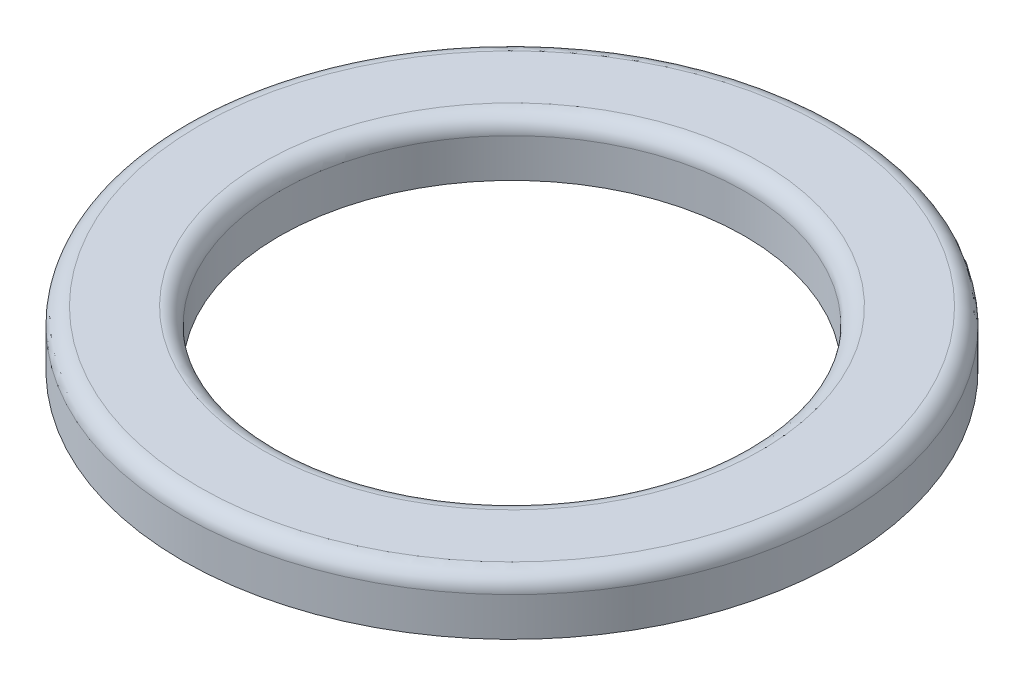
ISO-10303-21;
HEADER;
FILE_DESCRIPTION(('STEP AP214'),'2;1');
FILE_NAME('part.step','',(''),(''),'','','');
FILE_SCHEMA(('AUTOMOTIVE_DESIGN { 1 0 10303 214 1 1 1 1 }'));
ENDSEC;
DATA;
#1=APPLICATION_CONTEXT('core data for automotive mechanical design processes');
#2=APPLICATION_PROTOCOL_DEFINITION('international standard','automotive_design',2000,#1);
#3=PRODUCT_CONTEXT('',#1,'mechanical');
#4=PRODUCT('Part','Part','',(#3));
#5=PRODUCT_RELATED_PRODUCT_CATEGORY('part','',(#4));
#6=PRODUCT_DEFINITION_FORMATION('','',#4);
#7=PRODUCT_DEFINITION_CONTEXT('part definition',#1,'design');
#8=PRODUCT_DEFINITION('design','',#6,#7);
#9=PRODUCT_DEFINITION_SHAPE('','',#8);
#10=(LENGTH_UNIT() NAMED_UNIT(*) SI_UNIT(.MILLI.,.METRE.));
#11=(NAMED_UNIT(*) PLANE_ANGLE_UNIT() SI_UNIT($,.RADIAN.));
#12=(NAMED_UNIT(*) SI_UNIT($,.STERADIAN.) SOLID_ANGLE_UNIT());
#13=UNCERTAINTY_MEASURE_WITH_UNIT(LENGTH_MEASURE(1.E-05),#10,'distance_accuracy_value','');
#14=(GEOMETRIC_REPRESENTATION_CONTEXT(3) GLOBAL_UNCERTAINTY_ASSIGNED_CONTEXT((#13)) GLOBAL_UNIT_ASSIGNED_CONTEXT((#10,
#11,#12)) REPRESENTATION_CONTEXT('',''));
#15=CARTESIAN_POINT('',(0.,0.,0.));
#16=DIRECTION('',(0.,0.,1.));
#17=DIRECTION('',(1.,0.,0.));
#18=AXIS2_PLACEMENT_3D('',#15,#16,#17);
#19=CARTESIAN_POINT('',(0.,1.,0.));
#20=DIRECTION('',(0.,1.,0.));
#21=DIRECTION('',(0.,0.,1.));
#22=AXIS2_PLACEMENT_3D('',#19,#20,#21);
#23=PLANE('',#22);
#24=CARTESIAN_POINT('',(0.,1.,0.));
#25=DIRECTION('',(0.,1.,0.));
#26=DIRECTION('',(0.,0.,1.));
#27=AXIS2_PLACEMENT_3D('',#24,#25,#26);
#28=CIRCLE('',#27,5.65);
#29=CARTESIAN_POINT('',(0.,1.,5.65));
#30=VERTEX_POINT('',#29);
#31=EDGE_CURVE('E48',#30,#30,#28,.T.);
#32=ORIENTED_EDGE('',*,*,#31,.T.);
#33=EDGE_LOOP('',(#32));
#34=FACE_BOUND('',#33,.T.);
#35=CARTESIAN_POINT('',(0.,1.,0.));
#36=DIRECTION('',(0.,1.,0.));
#37=DIRECTION('',(0.,0.,1.));
#38=AXIS2_PLACEMENT_3D('',#35,#36,#37);
#39=CIRCLE('',#38,4.5);
#40=CARTESIAN_POINT('',(0.,1.,4.5));
#41=VERTEX_POINT('',#40);
#42=EDGE_CURVE('E52',#41,#41,#39,.F.);
#43=ORIENTED_EDGE('',*,*,#42,.T.);
#44=EDGE_LOOP('',(#43));
#45=FACE_BOUND('',#44,.T.);
#46=ADVANCED_FACE('F37',(#34,#45),#23,.T.);
#47=CARTESIAN_POINT('',(0.,0.,0.));
#48=DIRECTION('',(0.,1.,0.));
#49=DIRECTION('',(0.,0.,1.));
#50=AXIS2_PLACEMENT_3D('',#47,#48,#49);
#51=PLANE('',#50);
#52=CARTESIAN_POINT('',(0.,0.,0.));
#53=DIRECTION('',(0.,1.,0.));
#54=DIRECTION('',(0.,0.,1.));
#55=AXIS2_PLACEMENT_3D('',#52,#53,#54);
#56=CIRCLE('',#55,5.95);
#57=CARTESIAN_POINT('',(0.,0.,5.95));
#58=VERTEX_POINT('',#57);
#59=EDGE_CURVE('E57',#58,#58,#56,.T.);
#60=ORIENTED_EDGE('',*,*,#59,.F.);
#61=EDGE_LOOP('',(#60));
#62=FACE_BOUND('',#61,.T.);
#63=CARTESIAN_POINT('',(0.,0.,0.));
#64=DIRECTION('',(0.,1.,0.));
#65=DIRECTION('',(0.,0.,1.));
#66=AXIS2_PLACEMENT_3D('',#63,#64,#65);
#67=CIRCLE('',#66,4.2);
#68=CARTESIAN_POINT('',(0.,0.,4.2));
#69=VERTEX_POINT('',#68);
#70=EDGE_CURVE('E60',#69,#69,#67,.T.);
#71=ORIENTED_EDGE('',*,*,#70,.T.);
#72=EDGE_LOOP('',(#71));
#73=FACE_BOUND('',#72,.T.);
#74=ADVANCED_FACE('F64',(#62,#73),#51,.F.);
#75=CARTESIAN_POINT('',(0.,1.,0.));
#76=DIRECTION('',(0.,-1.,0.));
#77=DIRECTION('',(0.,0.,-1.));
#78=AXIS2_PLACEMENT_3D('',#75,#76,#77);
#79=CYLINDRICAL_SURFACE('',#78,5.95);
#80=CARTESIAN_POINT('',(0.,0.7,0.));
#81=DIRECTION('',(0.,1.,0.));
#82=DIRECTION('',(0.,0.,1.));
#83=AXIS2_PLACEMENT_3D('',#80,#81,#82);
#84=CIRCLE('',#83,5.95);
#85=CARTESIAN_POINT('',(0.,0.7,5.95));
#86=VERTEX_POINT('',#85);
#87=EDGE_CURVE('E44',#86,#86,#84,.F.);
#88=ORIENTED_EDGE('',*,*,#87,.T.);
#89=EDGE_LOOP('',(#88));
#90=FACE_BOUND('',#89,.T.);
#91=ORIENTED_EDGE('',*,*,#59,.T.);
#92=EDGE_LOOP('',(#91));
#93=FACE_BOUND('',#92,.T.);
#94=ADVANCED_FACE('F69',(#90,#93),#79,.T.);
#95=CARTESIAN_POINT('',(0.,1.,0.));
#96=DIRECTION('',(0.,-1.,0.));
#97=DIRECTION('',(0.,0.,-1.));
#98=AXIS2_PLACEMENT_3D('',#95,#96,#97);
#99=CYLINDRICAL_SURFACE('',#98,4.2);
#100=CARTESIAN_POINT('',(0.,0.7,0.));
#101=DIRECTION('',(0.,1.,0.));
#102=DIRECTION('',(0.,0.,1.));
#103=AXIS2_PLACEMENT_3D('',#100,#101,#102);
#104=CIRCLE('',#103,4.2);
#105=CARTESIAN_POINT('',(0.,0.7,4.2));
#106=VERTEX_POINT('',#105);
#107=EDGE_CURVE('E10',#106,#106,#104,.T.);
#108=ORIENTED_EDGE('',*,*,#107,.T.);
#109=EDGE_LOOP('',(#108));
#110=FACE_BOUND('',#109,.T.);
#111=ORIENTED_EDGE('',*,*,#70,.F.);
#112=EDGE_LOOP('',(#111));
#113=FACE_BOUND('',#112,.T.);
#114=ADVANCED_FACE('F66',(#110,#113),#99,.F.);
#115=CARTESIAN_POINT('',(0.,0.7,0.));
#116=DIRECTION('',(0.,1.,0.));
#117=DIRECTION('',(0.,0.,1.));
#118=AXIS2_PLACEMENT_3D('',#115,#116,#117);
#119=TOROIDAL_SURFACE('',#118,5.65,0.3);
#120=ORIENTED_EDGE('',*,*,#87,.F.);
#121=EDGE_LOOP('',(#120));
#122=FACE_BOUND('',#121,.T.);
#123=ORIENTED_EDGE('',*,*,#31,.F.);
#124=EDGE_LOOP('',(#123));
#125=FACE_BOUND('',#124,.T.);
#126=ADVANCED_FACE('F68',(#122,#125),#119,.T.);
#127=CARTESIAN_POINT('',(0.,0.7,0.));
#128=DIRECTION('',(0.,1.,0.));
#129=DIRECTION('',(0.,0.,1.));
#130=AXIS2_PLACEMENT_3D('',#127,#128,#129);
#131=TOROIDAL_SURFACE('',#130,4.5,0.3);
#132=ORIENTED_EDGE('',*,*,#42,.F.);
#133=EDGE_LOOP('',(#132));
#134=FACE_BOUND('',#133,.T.);
#135=ORIENTED_EDGE('',*,*,#107,.F.);
#136=EDGE_LOOP('',(#135));
#137=FACE_BOUND('',#136,.T.);
#138=ADVANCED_FACE('F39',(#134,#137),#131,.T.);
#139=CLOSED_SHELL('',(#46,#74,#94,#114,#126,#138));
#140=MANIFOLD_SOLID_BREP('B2',#139);
#141=ADVANCED_BREP_SHAPE_REPRESENTATION('',(#18,#140),#14);
#142=SHAPE_DEFINITION_REPRESENTATION(#9,#141);
ENDSEC;
END-ISO-10303-21;
